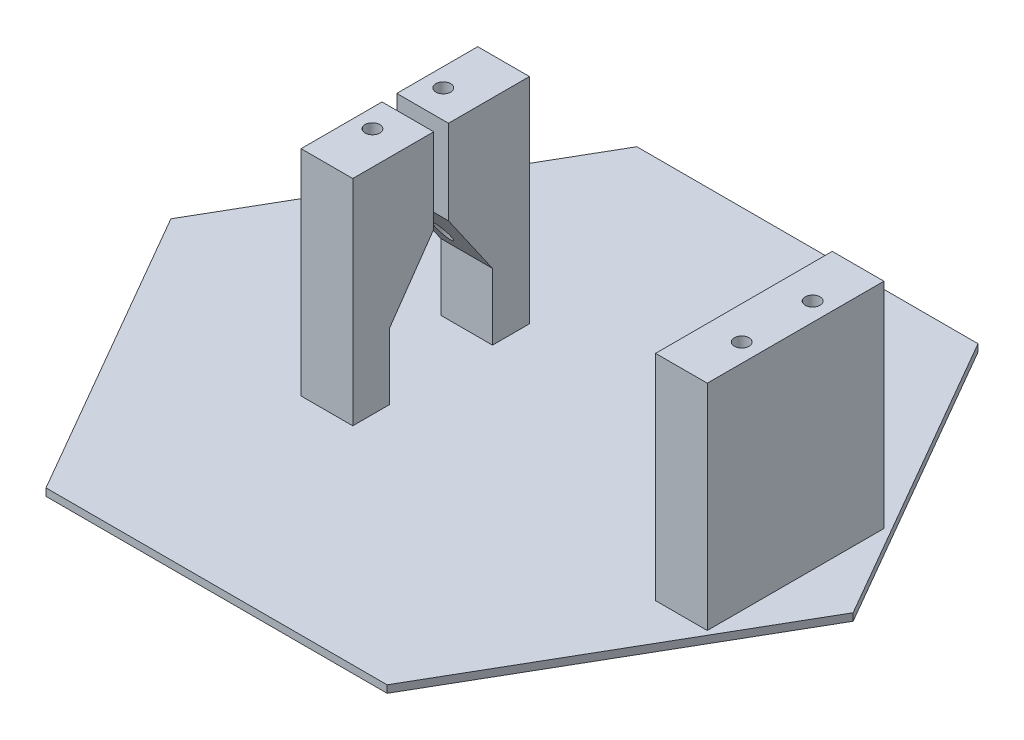
ISO-10303-21;
HEADER;
FILE_DESCRIPTION(('STEP AP214'),'2;1');
FILE_NAME('part.step','',(''),(''),'','','');
FILE_SCHEMA(('AUTOMOTIVE_DESIGN { 1 0 10303 214 1 1 1 1 }'));
ENDSEC;
DATA;
#1=APPLICATION_CONTEXT('core data for automotive mechanical design processes');
#2=APPLICATION_PROTOCOL_DEFINITION('international standard','automotive_design',2000,#1);
#3=PRODUCT_CONTEXT('',#1,'mechanical');
#4=PRODUCT('Part','Part','',(#3));
#5=PRODUCT_RELATED_PRODUCT_CATEGORY('part','',(#4));
#6=PRODUCT_DEFINITION_FORMATION('','',#4);
#7=PRODUCT_DEFINITION_CONTEXT('part definition',#1,'design');
#8=PRODUCT_DEFINITION('design','',#6,#7);
#9=PRODUCT_DEFINITION_SHAPE('','',#8);
#10=(LENGTH_UNIT() NAMED_UNIT(*) SI_UNIT(.MILLI.,.METRE.));
#11=(NAMED_UNIT(*) PLANE_ANGLE_UNIT() SI_UNIT($,.RADIAN.));
#12=(NAMED_UNIT(*) SI_UNIT($,.STERADIAN.) SOLID_ANGLE_UNIT());
#13=UNCERTAINTY_MEASURE_WITH_UNIT(LENGTH_MEASURE(1.E-05),#10,'distance_accuracy_value','');
#14=(GEOMETRIC_REPRESENTATION_CONTEXT(3) GLOBAL_UNCERTAINTY_ASSIGNED_CONTEXT((#13)) GLOBAL_UNIT_ASSIGNED_CONTEXT((#10,
#11,#12)) REPRESENTATION_CONTEXT('',''));
#15=CARTESIAN_POINT('',(0.,0.,0.));
#16=DIRECTION('',(0.,0.,1.));
#17=DIRECTION('',(1.,0.,0.));
#18=AXIS2_PLACEMENT_3D('',#15,#16,#17);
#19=CARTESIAN_POINT('',(-16.6,30.,-6.96020627017977));
#20=DIRECTION('',(1.,0.,0.));
#21=DIRECTION('',(0.,0.,-1.));
#22=AXIS2_PLACEMENT_3D('',#19,#20,#21);
#23=PLANE('',#22);
#24=DIRECTION('',(0.,1.,0.));
#25=VECTOR('',#24,1.);
#26=CARTESIAN_POINT('',(-16.6,-0.001000000000001,-1.));
#27=LINE('',#26,#25);
#28=CARTESIAN_POINT('',(-16.6,18.5632609707497,-1.));
#29=VERTEX_POINT('',#28);
#30=CARTESIAN_POINT('',(-16.6,30.,-1.));
#31=VERTEX_POINT('',#30);
#32=EDGE_CURVE('E62',#29,#31,#27,.T.);
#33=ORIENTED_EDGE('',*,*,#32,.T.);
#34=DIRECTION('',(0.,0.,1.));
#35=VECTOR('',#34,1.);
#36=CARTESIAN_POINT('',(-16.6,30.,-6.96020627017977));
#37=LINE('',#36,#35);
#38=CARTESIAN_POINT('',(-16.6,30.,-11.9602062701798));
#39=VERTEX_POINT('',#38);
#40=EDGE_CURVE('E323',#39,#31,#37,.T.);
#41=ORIENTED_EDGE('',*,*,#40,.F.);
#42=DIRECTION('',(0.,-1.,0.));
#43=VECTOR('',#42,1.);
#44=CARTESIAN_POINT('',(-16.6,30.,-11.9602062701798));
#45=LINE('',#44,#43);
#46=CARTESIAN_POINT('',(-16.6,1.,-11.9602062701798));
#47=VERTEX_POINT('',#46);
#48=EDGE_CURVE('E219',#39,#47,#45,.T.);
#49=ORIENTED_EDGE('',*,*,#48,.T.);
#50=DIRECTION('',(0.,0.,1.));
#51=VECTOR('',#50,1.);
#52=CARTESIAN_POINT('',(-16.6,1.,-6.96020627017977));
#53=LINE('',#52,#51);
#54=CARTESIAN_POINT('',(-16.6,1.,-6.96020627017977));
#55=VERTEX_POINT('',#54);
#56=EDGE_CURVE('E311',#47,#55,#53,.T.);
#57=ORIENTED_EDGE('',*,*,#56,.T.);
#58=DIRECTION('',(0.,-1.,0.));
#59=VECTOR('',#58,1.);
#60=CARTESIAN_POINT('',(-16.6,30.,-6.96020627017977));
#61=LINE('',#60,#59);
#62=CARTESIAN_POINT('',(-16.6,10.,-6.96020627017977));
#63=VERTEX_POINT('',#62);
#64=EDGE_CURVE('E224',#63,#55,#61,.T.);
#65=ORIENTED_EDGE('',*,*,#64,.F.);
#66=DIRECTION('',(0.,0.820763408438593,0.571268262174841));
#67=VECTOR('',#66,1.);
#68=CARTESIAN_POINT('',(-16.6,10.,-6.96020627017977));
#69=LINE('',#68,#67);
#70=EDGE_CURVE('E231',#63,#29,#69,.T.);
#71=ORIENTED_EDGE('',*,*,#70,.T.);
#72=EDGE_LOOP('',(#33,#41,#49,#57,#65,#71));
#73=FACE_BOUND('',#72,.T.);
#74=ADVANCED_FACE('F46',(#73),#23,.F.);
#75=CARTESIAN_POINT('',(-9.6,30.,-11.9602062701798));
#76=DIRECTION('',(-1.,0.,0.));
#77=DIRECTION('',(0.,0.,1.));
#78=AXIS2_PLACEMENT_3D('',#75,#76,#77);
#79=PLANE('',#78);
#80=DIRECTION('',(0.,1.,0.));
#81=VECTOR('',#80,1.);
#82=CARTESIAN_POINT('',(-9.6,-0.001000000000001,-1.));
#83=LINE('',#82,#81);
#84=CARTESIAN_POINT('',(-9.6,18.5632609707497,-1.));
#85=VERTEX_POINT('',#84);
#86=CARTESIAN_POINT('',(-9.6,30.,-1.));
#87=VERTEX_POINT('',#86);
#88=EDGE_CURVE('E196',#85,#87,#83,.T.);
#89=ORIENTED_EDGE('',*,*,#88,.F.);
#90=DIRECTION('',(0.,-0.820763408438594,-0.571268262174841));
#91=VECTOR('',#90,1.);
#92=CARTESIAN_POINT('',(-9.6,10.,-6.96020627017976));
#93=LINE('',#92,#91);
#94=CARTESIAN_POINT('',(-9.6,10.,-6.96020627017977));
#95=VERTEX_POINT('',#94);
#96=EDGE_CURVE('E208',#85,#95,#93,.T.);
#97=ORIENTED_EDGE('',*,*,#96,.T.);
#98=DIRECTION('',(0.,-1.,0.));
#99=VECTOR('',#98,1.);
#100=CARTESIAN_POINT('',(-9.6,30.,-6.96020627017977));
#101=LINE('',#100,#99);
#102=CARTESIAN_POINT('',(-9.6,1.,-6.96020627017977));
#103=VERTEX_POINT('',#102);
#104=EDGE_CURVE('E296',#95,#103,#101,.T.);
#105=ORIENTED_EDGE('',*,*,#104,.T.);
#106=DIRECTION('',(0.,0.,-1.));
#107=VECTOR('',#106,1.);
#108=CARTESIAN_POINT('',(-9.6,1.,-11.9602062701798));
#109=LINE('',#108,#107);
#110=CARTESIAN_POINT('',(-9.6,1.,-11.9602062701798));
#111=VERTEX_POINT('',#110);
#112=EDGE_CURVE('E303',#103,#111,#109,.T.);
#113=ORIENTED_EDGE('',*,*,#112,.T.);
#114=DIRECTION('',(0.,-1.,0.));
#115=VECTOR('',#114,1.);
#116=CARTESIAN_POINT('',(-9.6,30.,-11.9602062701798));
#117=LINE('',#116,#115);
#118=CARTESIAN_POINT('',(-9.6,30.,-11.9602062701798));
#119=VERTEX_POINT('',#118);
#120=EDGE_CURVE('E299',#119,#111,#117,.T.);
#121=ORIENTED_EDGE('',*,*,#120,.F.);
#122=DIRECTION('',(0.,0.,-1.));
#123=VECTOR('',#122,1.);
#124=CARTESIAN_POINT('',(-9.6,30.,-11.9602062701798));
#125=LINE('',#124,#123);
#126=EDGE_CURVE('E211',#87,#119,#125,.T.);
#127=ORIENTED_EDGE('',*,*,#126,.F.);
#128=EDGE_LOOP('',(#89,#97,#105,#113,#121,#127));
#129=FACE_BOUND('',#128,.T.);
#130=ADVANCED_FACE('F207',(#129),#79,.F.);
#131=CARTESIAN_POINT('',(0.,30.,0.));
#132=DIRECTION('',(0.,-1.,0.));
#133=DIRECTION('',(0.,0.,-1.));
#134=AXIS2_PLACEMENT_3D('',#131,#132,#133);
#135=PLANE('',#134);
#136=CARTESIAN_POINT('',(-14.1,30.,-4.8));
#137=DIRECTION('',(0.,-1.,0.));
#138=DIRECTION('',(0.,0.,-1.));
#139=AXIS2_PLACEMENT_3D('',#136,#137,#138);
#140=CIRCLE('',#139,1.);
#141=CARTESIAN_POINT('',(-14.1,30.,-5.8));
#142=VERTEX_POINT('',#141);
#143=EDGE_CURVE('E495',#142,#142,#140,.T.);
#144=ORIENTED_EDGE('',*,*,#143,.T.);
#145=EDGE_LOOP('',(#144));
#146=FACE_BOUND('',#145,.T.);
#147=DIRECTION('',(1.,0.,0.));
#148=VECTOR('',#147,1.);
#149=CARTESIAN_POINT('',(-16.6,30.,-1.));
#150=LINE('',#149,#148);
#151=EDGE_CURVE('E486',#31,#87,#150,.T.);
#152=ORIENTED_EDGE('',*,*,#151,.T.);
#153=ORIENTED_EDGE('',*,*,#126,.T.);
#154=DIRECTION('',(-1.,0.,0.));
#155=VECTOR('',#154,1.);
#156=CARTESIAN_POINT('',(-16.6,30.,-11.9602062701798));
#157=LINE('',#156,#155);
#158=EDGE_CURVE('E307',#119,#39,#157,.T.);
#159=ORIENTED_EDGE('',*,*,#158,.T.);
#160=ORIENTED_EDGE('',*,*,#40,.T.);
#161=EDGE_LOOP('',(#152,#153,#159,#160));
#162=FACE_BOUND('',#161,.T.);
#163=ADVANCED_FACE('F455',(#146,#162),#135,.F.);
#164=CARTESIAN_POINT('',(14.7675580494599,10.,-6.96020627017977));
#165=DIRECTION('',(0.,-0.571268262174841,0.820763408438593));
#166=DIRECTION('',(0.,-0.820763408438594,-0.571268262174841));
#167=AXIS2_PLACEMENT_3D('',#164,#165,#166);
#168=PLANE('',#167);
#169=CARTESIAN_POINT('',(-14.1,13.1036526595985,-4.8));
#170=DIRECTION('',(0.,-0.571268262174841,0.820763408438593));
#171=DIRECTION('',(0.,-0.820763408438594,-0.571268262174841));
#172=AXIS2_PLACEMENT_3D('',#169,#170,#171);
#173=ELLIPSE('',#172,1.75049108485909,1.);
#174=CARTESIAN_POINT('',(-14.1,11.6669136303482,-5.8));
#175=VERTEX_POINT('',#174);
#176=EDGE_CURVE('E229',#175,#175,#173,.F.);
#177=ORIENTED_EDGE('',*,*,#176,.T.);
#178=EDGE_LOOP('',(#177));
#179=FACE_BOUND('',#178,.T.);
#180=ORIENTED_EDGE('',*,*,#96,.F.);
#181=DIRECTION('',(1.,0.,0.));
#182=VECTOR('',#181,1.);
#183=CARTESIAN_POINT('',(-16.6,18.5632609707497,-1.));
#184=LINE('',#183,#182);
#185=EDGE_CURVE('E193',#29,#85,#184,.T.);
#186=ORIENTED_EDGE('',*,*,#185,.F.);
#187=ORIENTED_EDGE('',*,*,#70,.F.);
#188=DIRECTION('',(-1.,0.,0.));
#189=VECTOR('',#188,1.);
#190=CARTESIAN_POINT('',(14.7675580494599,10.,-6.96020627017977));
#191=LINE('',#190,#189);
#192=EDGE_CURVE('E216',#95,#63,#191,.T.);
#193=ORIENTED_EDGE('',*,*,#192,.F.);
#194=EDGE_LOOP('',(#180,#186,#187,#193));
#195=FACE_BOUND('',#194,.T.);
#196=ADVANCED_FACE('F214',(#179,#195),#168,.T.);
#197=CARTESIAN_POINT('',(-16.6,30.,6.96020627017977));
#198=DIRECTION('',(0.,0.,1.));
#199=DIRECTION('',(1.,0.,0.));
#200=AXIS2_PLACEMENT_3D('',#197,#198,#199);
#201=PLANE('',#200);
#202=DIRECTION('',(-1.,0.,0.));
#203=VECTOR('',#202,1.);
#204=CARTESIAN_POINT('',(14.7675580494599,10.,6.96020627017977));
#205=LINE('',#204,#203);
#206=CARTESIAN_POINT('',(-9.59999999999998,10.,6.96020627017977));
#207=VERTEX_POINT('',#206);
#208=CARTESIAN_POINT('',(-16.6,10.,6.96020627017977));
#209=VERTEX_POINT('',#208);
#210=EDGE_CURVE('E238',#207,#209,#205,.T.);
#211=ORIENTED_EDGE('',*,*,#210,.F.);
#212=DIRECTION('',(0.,-1.,0.));
#213=VECTOR('',#212,1.);
#214=CARTESIAN_POINT('',(-9.6,30.,6.96020627017977));
#215=LINE('',#214,#213);
#216=CARTESIAN_POINT('',(-9.6,1.,6.96020627017977));
#217=VERTEX_POINT('',#216);
#218=EDGE_CURVE('E351',#207,#217,#215,.T.);
#219=ORIENTED_EDGE('',*,*,#218,.T.);
#220=DIRECTION('',(-1.,0.,0.));
#221=VECTOR('',#220,1.);
#222=CARTESIAN_POINT('',(-16.6,1.,6.96020627017977));
#223=LINE('',#222,#221);
#224=CARTESIAN_POINT('',(-16.6,1.,6.96020627017977));
#225=VERTEX_POINT('',#224);
#226=EDGE_CURVE('E335',#217,#225,#223,.T.);
#227=ORIENTED_EDGE('',*,*,#226,.T.);
#228=DIRECTION('',(0.,-1.,0.));
#229=VECTOR('',#228,1.);
#230=CARTESIAN_POINT('',(-16.6,30.,6.96020627017977));
#231=LINE('',#230,#229);
#232=EDGE_CURVE('E334',#209,#225,#231,.T.);
#233=ORIENTED_EDGE('',*,*,#232,.F.);
#234=EDGE_LOOP('',(#211,#219,#227,#233));
#235=FACE_BOUND('',#234,.T.);
#236=ADVANCED_FACE('F445',(#235),#201,.F.);
#237=CARTESIAN_POINT('',(0.,1.,0.));
#238=DIRECTION('',(0.,1.,0.));
#239=DIRECTION('',(0.,0.,1.));
#240=AXIS2_PLACEMENT_3D('',#237,#238,#239);
#241=PLANE('',#240);
#242=ORIENTED_EDGE('',*,*,#56,.F.);
#243=DIRECTION('',(-1.,0.,0.));
#244=VECTOR('',#243,1.);
#245=CARTESIAN_POINT('',(-16.6,1.,-11.9602062701798));
#246=LINE('',#245,#244);
#247=EDGE_CURVE('E247',#111,#47,#246,.T.);
#248=ORIENTED_EDGE('',*,*,#247,.F.);
#249=ORIENTED_EDGE('',*,*,#112,.F.);
#250=DIRECTION('',(1.,0.,0.));
#251=VECTOR('',#250,1.);
#252=CARTESIAN_POINT('',(-16.6,1.,-6.96020627017977));
#253=LINE('',#252,#251);
#254=EDGE_CURVE('E306',#55,#103,#253,.T.);
#255=ORIENTED_EDGE('',*,*,#254,.F.);
#256=EDGE_LOOP('',(#242,#248,#249,#255));
#257=FACE_BOUND('',#256,.T.);
#258=DIRECTION('',(1.,0.,0.));
#259=VECTOR('',#258,1.);
#260=CARTESIAN_POINT('',(-9.6,1.,11.9602062701798));
#261=LINE('',#260,#259);
#262=CARTESIAN_POINT('',(-16.6,1.,11.9602062701798));
#263=VERTEX_POINT('',#262);
#264=CARTESIAN_POINT('',(-9.6,1.,11.9602062701798));
#265=VERTEX_POINT('',#264);
#266=EDGE_CURVE('E339',#263,#265,#261,.T.);
#267=ORIENTED_EDGE('',*,*,#266,.F.);
#268=DIRECTION('',(0.,0.,1.));
#269=VECTOR('',#268,1.);
#270=CARTESIAN_POINT('',(-16.6,1.,11.9602062701798));
#271=LINE('',#270,#269);
#272=EDGE_CURVE('E292',#225,#263,#271,.T.);
#273=ORIENTED_EDGE('',*,*,#272,.F.);
#274=ORIENTED_EDGE('',*,*,#226,.F.);
#275=DIRECTION('',(0.,0.,-1.));
#276=VECTOR('',#275,1.);
#277=CARTESIAN_POINT('',(-9.6,1.,6.96020627017977));
#278=LINE('',#277,#276);
#279=EDGE_CURVE('E342',#265,#217,#278,.T.);
#280=ORIENTED_EDGE('',*,*,#279,.F.);
#281=EDGE_LOOP('',(#267,#273,#274,#280));
#282=FACE_BOUND('',#281,.T.);
#283=DIRECTION('',(0.5,0.,-0.866025403784439));
#284=VECTOR('',#283,1.);
#285=CARTESIAN_POINT('',(23.094010767585,1.,40.));
#286=LINE('',#285,#284);
#287=CARTESIAN_POINT('',(23.094010767585,1.,40.));
#288=VERTEX_POINT('',#287);
#289=CARTESIAN_POINT('',(46.1880215351701,1.,0.));
#290=VERTEX_POINT('',#289);
#291=EDGE_CURVE('E362',#288,#290,#286,.T.);
#292=ORIENTED_EDGE('',*,*,#291,.T.);
#293=DIRECTION('',(-0.5,0.,-0.866025403784439));
#294=VECTOR('',#293,1.);
#295=CARTESIAN_POINT('',(46.1880215351701,1.,0.));
#296=LINE('',#295,#294);
#297=CARTESIAN_POINT('',(23.094010767585,1.,-40.));
#298=VERTEX_POINT('',#297);
#299=EDGE_CURVE('E366',#290,#298,#296,.T.);
#300=ORIENTED_EDGE('',*,*,#299,.T.);
#301=DIRECTION('',(-1.,0.,0.));
#302=VECTOR('',#301,1.);
#303=CARTESIAN_POINT('',(23.094010767585,1.,-40.));
#304=LINE('',#303,#302);
#305=CARTESIAN_POINT('',(-23.094010767585,1.,-40.));
#306=VERTEX_POINT('',#305);
#307=EDGE_CURVE('E370',#298,#306,#304,.T.);
#308=ORIENTED_EDGE('',*,*,#307,.T.);
#309=DIRECTION('',(-0.5,0.,0.866025403784439));
#310=VECTOR('',#309,1.);
#311=CARTESIAN_POINT('',(-23.094010767585,1.,-40.));
#312=LINE('',#311,#310);
#313=CARTESIAN_POINT('',(-46.1880215351701,1.,0.));
#314=VERTEX_POINT('',#313);
#315=EDGE_CURVE('E373',#306,#314,#312,.T.);
#316=ORIENTED_EDGE('',*,*,#315,.T.);
#317=DIRECTION('',(0.5,0.,0.866025403784439));
#318=VECTOR('',#317,1.);
#319=CARTESIAN_POINT('',(-46.1880215351701,1.,0.));
#320=LINE('',#319,#318);
#321=CARTESIAN_POINT('',(-23.094010767585,1.,40.));
#322=VERTEX_POINT('',#321);
#323=EDGE_CURVE('E376',#314,#322,#320,.T.);
#324=ORIENTED_EDGE('',*,*,#323,.T.);
#325=DIRECTION('',(1.,0.,0.));
#326=VECTOR('',#325,1.);
#327=CARTESIAN_POINT('',(-23.094010767585,1.,40.));
#328=LINE('',#327,#326);
#329=EDGE_CURVE('E379',#322,#288,#328,.T.);
#330=ORIENTED_EDGE('',*,*,#329,.T.);
#331=EDGE_LOOP('',(#292,#300,#308,#316,#324,#330));
#332=FACE_BOUND('',#331,.T.);
#333=DIRECTION('',(0.,0.,1.));
#334=VECTOR('',#333,1.);
#335=CARTESIAN_POINT('',(31.4,1.,-11.9602062701798));
#336=LINE('',#335,#334);
#337=CARTESIAN_POINT('',(31.4,1.,-11.9602062701798));
#338=VERTEX_POINT('',#337);
#339=CARTESIAN_POINT('',(31.4,1.,11.9602062701798));
#340=VERTEX_POINT('',#339);
#341=EDGE_CURVE('E267',#338,#340,#336,.T.);
#342=ORIENTED_EDGE('',*,*,#341,.F.);
#343=DIRECTION('',(-1.,0.,0.));
#344=VECTOR('',#343,1.);
#345=CARTESIAN_POINT('',(31.4,1.,-11.9602062701798));
#346=LINE('',#345,#344);
#347=CARTESIAN_POINT('',(38.4,1.,-11.9602062701798));
#348=VERTEX_POINT('',#347);
#349=EDGE_CURVE('E270',#348,#338,#346,.T.);
#350=ORIENTED_EDGE('',*,*,#349,.F.);
#351=DIRECTION('',(0.,0.,-1.));
#352=VECTOR('',#351,1.);
#353=CARTESIAN_POINT('',(38.4,1.,11.9602062701798));
#354=LINE('',#353,#352);
#355=CARTESIAN_POINT('',(38.4,1.,11.9602062701798));
#356=VERTEX_POINT('',#355);
#357=EDGE_CURVE('E259',#356,#348,#354,.T.);
#358=ORIENTED_EDGE('',*,*,#357,.F.);
#359=DIRECTION('',(1.,0.,0.));
#360=VECTOR('',#359,1.);
#361=CARTESIAN_POINT('',(31.4,1.,11.9602062701798));
#362=LINE('',#361,#360);
#363=EDGE_CURVE('E262',#340,#356,#362,.T.);
#364=ORIENTED_EDGE('',*,*,#363,.F.);
#365=EDGE_LOOP('',(#342,#350,#358,#364));
#366=FACE_BOUND('',#365,.T.);
#367=ADVANCED_FACE('F432',(#257,#282,#332,#366),#241,.T.);
#368=CARTESIAN_POINT('',(23.094010767585,1.,40.));
#369=DIRECTION('',(-0.866025403784439,0.,-0.5));
#370=DIRECTION('',(-0.5,0.,0.866025403784439));
#371=AXIS2_PLACEMENT_3D('',#368,#369,#370);
#372=PLANE('',#371);
#373=DIRECTION('',(0.5,0.,-0.866025403784439));
#374=VECTOR('',#373,1.);
#375=CARTESIAN_POINT('',(23.094010767585,0.,40.));
#376=LINE('',#375,#374);
#377=CARTESIAN_POINT('',(23.094010767585,0.,40.));
#378=VERTEX_POINT('',#377);
#379=CARTESIAN_POINT('',(46.1880215351701,0.,0.));
#380=VERTEX_POINT('',#379);
#381=EDGE_CURVE('E361',#378,#380,#376,.T.);
#382=ORIENTED_EDGE('',*,*,#381,.T.);
#383=DIRECTION('',(0.,-1.,0.));
#384=VECTOR('',#383,1.);
#385=CARTESIAN_POINT('',(46.1880215351701,1.,0.));
#386=LINE('',#385,#384);
#387=EDGE_CURVE('E419',#290,#380,#386,.T.);
#388=ORIENTED_EDGE('',*,*,#387,.F.);
#389=ORIENTED_EDGE('',*,*,#291,.F.);
#390=DIRECTION('',(0.,-1.,0.));
#391=VECTOR('',#390,1.);
#392=CARTESIAN_POINT('',(23.094010767585,1.,40.));
#393=LINE('',#392,#391);
#394=EDGE_CURVE('E382',#288,#378,#393,.T.);
#395=ORIENTED_EDGE('',*,*,#394,.T.);
#396=EDGE_LOOP('',(#382,#388,#389,#395));
#397=FACE_BOUND('',#396,.T.);
#398=ADVANCED_FACE('F48',(#397),#372,.F.);
#399=CARTESIAN_POINT('',(46.1880215351701,1.,0.));
#400=DIRECTION('',(-0.866025403784439,0.,0.5));
#401=DIRECTION('',(0.5,0.,0.866025403784439));
#402=AXIS2_PLACEMENT_3D('',#399,#400,#401);
#403=PLANE('',#402);
#404=DIRECTION('',(-0.5,0.,-0.866025403784439));
#405=VECTOR('',#404,1.);
#406=CARTESIAN_POINT('',(46.1880215351701,0.,0.));
#407=LINE('',#406,#405);
#408=CARTESIAN_POINT('',(23.094010767585,0.,-40.));
#409=VERTEX_POINT('',#408);
#410=EDGE_CURVE('E386',#380,#409,#407,.T.);
#411=ORIENTED_EDGE('',*,*,#410,.T.);
#412=DIRECTION('',(0.,-1.,0.));
#413=VECTOR('',#412,1.);
#414=CARTESIAN_POINT('',(23.094010767585,1.,-40.));
#415=LINE('',#414,#413);
#416=EDGE_CURVE('E415',#298,#409,#415,.T.);
#417=ORIENTED_EDGE('',*,*,#416,.F.);
#418=ORIENTED_EDGE('',*,*,#299,.F.);
#419=ORIENTED_EDGE('',*,*,#387,.T.);
#420=EDGE_LOOP('',(#411,#417,#418,#419));
#421=FACE_BOUND('',#420,.T.);
#422=ADVANCED_FACE('F813',(#421),#403,.F.);
#423=CARTESIAN_POINT('',(23.094010767585,1.,-40.));
#424=DIRECTION('',(0.,0.,1.));
#425=DIRECTION('',(1.,0.,0.));
#426=AXIS2_PLACEMENT_3D('',#423,#424,#425);
#427=PLANE('',#426);
#428=DIRECTION('',(-1.,0.,0.));
#429=VECTOR('',#428,1.);
#430=CARTESIAN_POINT('',(23.094010767585,0.,-40.));
#431=LINE('',#430,#429);
#432=CARTESIAN_POINT('',(-23.094010767585,0.,-40.));
#433=VERTEX_POINT('',#432);
#434=EDGE_CURVE('E389',#409,#433,#431,.T.);
#435=ORIENTED_EDGE('',*,*,#434,.T.);
#436=DIRECTION('',(0.,-1.,0.));
#437=VECTOR('',#436,1.);
#438=CARTESIAN_POINT('',(-23.094010767585,1.,-40.));
#439=LINE('',#438,#437);
#440=EDGE_CURVE('E411',#306,#433,#439,.T.);
#441=ORIENTED_EDGE('',*,*,#440,.F.);
#442=ORIENTED_EDGE('',*,*,#307,.F.);
#443=ORIENTED_EDGE('',*,*,#416,.T.);
#444=EDGE_LOOP('',(#435,#441,#442,#443));
#445=FACE_BOUND('',#444,.T.);
#446=ADVANCED_FACE('F803',(#445),#427,.F.);
#447=CARTESIAN_POINT('',(-23.094010767585,1.,-40.));
#448=DIRECTION('',(0.866025403784439,0.,0.5));
#449=DIRECTION('',(0.5,0.,-0.866025403784439));
#450=AXIS2_PLACEMENT_3D('',#447,#448,#449);
#451=PLANE('',#450);
#452=DIRECTION('',(-0.5,0.,0.866025403784439));
#453=VECTOR('',#452,1.);
#454=CARTESIAN_POINT('',(-23.094010767585,0.,-40.));
#455=LINE('',#454,#453);
#456=CARTESIAN_POINT('',(-46.1880215351701,0.,0.));
#457=VERTEX_POINT('',#456);
#458=EDGE_CURVE('E392',#433,#457,#455,.T.);
#459=ORIENTED_EDGE('',*,*,#458,.T.);
#460=DIRECTION('',(0.,-1.,0.));
#461=VECTOR('',#460,1.);
#462=CARTESIAN_POINT('',(-46.1880215351701,1.,0.));
#463=LINE('',#462,#461);
#464=EDGE_CURVE('E407',#314,#457,#463,.T.);
#465=ORIENTED_EDGE('',*,*,#464,.F.);
#466=ORIENTED_EDGE('',*,*,#315,.F.);
#467=ORIENTED_EDGE('',*,*,#440,.T.);
#468=EDGE_LOOP('',(#459,#465,#466,#467));
#469=FACE_BOUND('',#468,.T.);
#470=ADVANCED_FACE('F793',(#469),#451,.F.);
#471=CARTESIAN_POINT('',(-46.1880215351701,1.,0.));
#472=DIRECTION('',(0.866025403784439,0.,-0.5));
#473=DIRECTION('',(-0.5,0.,-0.866025403784439));
#474=AXIS2_PLACEMENT_3D('',#471,#472,#473);
#475=PLANE('',#474);
#476=DIRECTION('',(0.5,0.,0.866025403784439));
#477=VECTOR('',#476,1.);
#478=CARTESIAN_POINT('',(-46.1880215351701,0.,0.));
#479=LINE('',#478,#477);
#480=CARTESIAN_POINT('',(-23.094010767585,0.,40.));
#481=VERTEX_POINT('',#480);
#482=EDGE_CURVE('E395',#457,#481,#479,.T.);
#483=ORIENTED_EDGE('',*,*,#482,.T.);
#484=DIRECTION('',(0.,-1.,0.));
#485=VECTOR('',#484,1.);
#486=CARTESIAN_POINT('',(-23.094010767585,1.,40.));
#487=LINE('',#486,#485);
#488=EDGE_CURVE('E403',#322,#481,#487,.T.);
#489=ORIENTED_EDGE('',*,*,#488,.F.);
#490=ORIENTED_EDGE('',*,*,#323,.F.);
#491=ORIENTED_EDGE('',*,*,#464,.T.);
#492=EDGE_LOOP('',(#483,#489,#490,#491));
#493=FACE_BOUND('',#492,.T.);
#494=ADVANCED_FACE('F783',(#493),#475,.F.);
#495=CARTESIAN_POINT('',(-23.094010767585,1.,40.));
#496=DIRECTION('',(0.,0.,-1.));
#497=DIRECTION('',(-1.,0.,0.));
#498=AXIS2_PLACEMENT_3D('',#495,#496,#497);
#499=PLANE('',#498);
#500=DIRECTION('',(1.,0.,0.));
#501=VECTOR('',#500,1.);
#502=CARTESIAN_POINT('',(-23.094010767585,0.,40.));
#503=LINE('',#502,#501);
#504=EDGE_CURVE('E367',#481,#378,#503,.T.);
#505=ORIENTED_EDGE('',*,*,#504,.T.);
#506=ORIENTED_EDGE('',*,*,#394,.F.);
#507=ORIENTED_EDGE('',*,*,#329,.F.);
#508=ORIENTED_EDGE('',*,*,#488,.T.);
#509=EDGE_LOOP('',(#505,#506,#507,#508));
#510=FACE_BOUND('',#509,.T.);
#511=ADVANCED_FACE('F567',(#510),#499,.F.);
#512=CARTESIAN_POINT('',(0.,0.,0.));
#513=DIRECTION('',(0.,1.,0.));
#514=DIRECTION('',(0.,0.,1.));
#515=AXIS2_PLACEMENT_3D('',#512,#513,#514);
#516=PLANE('',#515);
#517=ORIENTED_EDGE('',*,*,#381,.F.);
#518=ORIENTED_EDGE('',*,*,#504,.F.);
#519=ORIENTED_EDGE('',*,*,#482,.F.);
#520=ORIENTED_EDGE('',*,*,#458,.F.);
#521=ORIENTED_EDGE('',*,*,#434,.F.);
#522=ORIENTED_EDGE('',*,*,#410,.F.);
#523=EDGE_LOOP('',(#517,#518,#519,#520,#521,#522));
#524=FACE_BOUND('',#523,.T.);
#525=ADVANCED_FACE('F563',(#524),#516,.F.);
#526=CARTESIAN_POINT('',(-9.6,30.,11.9602062701798));
#527=DIRECTION('',(0.,0.,-1.));
#528=DIRECTION('',(-1.,0.,0.));
#529=AXIS2_PLACEMENT_3D('',#526,#527,#528);
#530=PLANE('',#529);
#531=ORIENTED_EDGE('',*,*,#266,.T.);
#532=DIRECTION('',(0.,-1.,0.));
#533=VECTOR('',#532,1.);
#534=CARTESIAN_POINT('',(-9.6,30.,11.9602062701798));
#535=LINE('',#534,#533);
#536=CARTESIAN_POINT('',(-9.6,30.,11.9602062701798));
#537=VERTEX_POINT('',#536);
#538=EDGE_CURVE('E354',#537,#265,#535,.T.);
#539=ORIENTED_EDGE('',*,*,#538,.F.);
#540=DIRECTION('',(1.,0.,0.));
#541=VECTOR('',#540,1.);
#542=CARTESIAN_POINT('',(-9.6,30.,11.9602062701798));
#543=LINE('',#542,#541);
#544=CARTESIAN_POINT('',(-16.6,30.,11.9602062701798));
#545=VERTEX_POINT('',#544);
#546=EDGE_CURVE('E330',#545,#537,#543,.T.);
#547=ORIENTED_EDGE('',*,*,#546,.F.);
#548=DIRECTION('',(0.,-1.,0.));
#549=VECTOR('',#548,1.);
#550=CARTESIAN_POINT('',(-16.6,30.,11.9602062701798));
#551=LINE('',#550,#549);
#552=EDGE_CURVE('E358',#545,#263,#551,.T.);
#553=ORIENTED_EDGE('',*,*,#552,.T.);
#554=EDGE_LOOP('',(#531,#539,#547,#553));
#555=FACE_BOUND('',#554,.T.);
#556=ADVANCED_FACE('F471',(#555),#530,.F.);
#557=CARTESIAN_POINT('',(-16.6,30.,-11.9602062701798));
#558=DIRECTION('',(0.,0.,1.));
#559=DIRECTION('',(1.,0.,0.));
#560=AXIS2_PLACEMENT_3D('',#557,#558,#559);
#561=PLANE('',#560);
#562=ORIENTED_EDGE('',*,*,#247,.T.);
#563=ORIENTED_EDGE('',*,*,#48,.F.);
#564=ORIENTED_EDGE('',*,*,#158,.F.);
#565=ORIENTED_EDGE('',*,*,#120,.T.);
#566=EDGE_LOOP('',(#562,#563,#564,#565));
#567=FACE_BOUND('',#566,.T.);
#568=ADVANCED_FACE('F462',(#567),#561,.F.);
#569=CARTESIAN_POINT('',(-16.6,30.,1.));
#570=VERTEX_POINT('',#569);
#571=EDGE_CURVE('E322',#570,#545,#37,.T.);
#572=ORIENTED_EDGE('',*,*,#571,.F.);
#573=DIRECTION('',(0.,1.,0.));
#574=VECTOR('',#573,1.);
#575=CARTESIAN_POINT('',(-16.6,-0.001000000000001,1.));
#576=LINE('',#575,#574);
#577=CARTESIAN_POINT('',(-16.6,18.5632609707497,1.));
#578=VERTEX_POINT('',#577);
#579=EDGE_CURVE('E477',#578,#570,#576,.T.);
#580=ORIENTED_EDGE('',*,*,#579,.F.);
#581=DIRECTION('',(0.,0.820763408438593,-0.571268262174841));
#582=VECTOR('',#581,1.);
#583=CARTESIAN_POINT('',(-16.6,10.,6.96020627017977));
#584=LINE('',#583,#582);
#585=EDGE_CURVE('E234',#209,#578,#584,.T.);
#586=ORIENTED_EDGE('',*,*,#585,.F.);
#587=ORIENTED_EDGE('',*,*,#232,.T.);
#588=ORIENTED_EDGE('',*,*,#272,.T.);
#589=ORIENTED_EDGE('',*,*,#552,.F.);
#590=EDGE_LOOP('',(#572,#580,#586,#587,#588,#589));
#591=FACE_BOUND('',#590,.T.);
#592=ADVANCED_FACE('F450',(#591),#23,.F.);
#593=CARTESIAN_POINT('',(-16.6,30.,-6.96020627017977));
#594=DIRECTION('',(0.,0.,-1.));
#595=DIRECTION('',(-1.,0.,0.));
#596=AXIS2_PLACEMENT_3D('',#593,#594,#595);
#597=PLANE('',#596);
#598=ORIENTED_EDGE('',*,*,#104,.F.);
#599=ORIENTED_EDGE('',*,*,#192,.T.);
#600=ORIENTED_EDGE('',*,*,#64,.T.);
#601=ORIENTED_EDGE('',*,*,#254,.T.);
#602=EDGE_LOOP('',(#598,#599,#600,#601));
#603=FACE_BOUND('',#602,.T.);
#604=ADVANCED_FACE('F461',(#603),#597,.F.);
#605=DIRECTION('',(0.,-0.820763408438594,0.571268262174841));
#606=VECTOR('',#605,1.);
#607=CARTESIAN_POINT('',(-9.59999999999998,9.99999999999998,6.96020627017978));
#608=LINE('',#607,#606);
#609=CARTESIAN_POINT('',(-9.59999999999999,18.5632609707497,1.00000000000001));
#610=VERTEX_POINT('',#609);
#611=EDGE_CURVE('E220',#610,#207,#608,.T.);
#612=ORIENTED_EDGE('',*,*,#611,.F.);
#613=DIRECTION('',(0.,1.,0.));
#614=VECTOR('',#613,1.);
#615=CARTESIAN_POINT('',(-9.6,-0.001000000000001,1.));
#616=LINE('',#615,#614);
#617=CARTESIAN_POINT('',(-9.6,30.,1.));
#618=VERTEX_POINT('',#617);
#619=EDGE_CURVE('E70',#610,#618,#616,.T.);
#620=ORIENTED_EDGE('',*,*,#619,.T.);
#621=EDGE_CURVE('E318',#537,#618,#125,.T.);
#622=ORIENTED_EDGE('',*,*,#621,.F.);
#623=ORIENTED_EDGE('',*,*,#538,.T.);
#624=ORIENTED_EDGE('',*,*,#279,.T.);
#625=ORIENTED_EDGE('',*,*,#218,.F.);
#626=EDGE_LOOP('',(#612,#620,#622,#623,#624,#625));
#627=FACE_BOUND('',#626,.T.);
#628=ADVANCED_FACE('F457',(#627),#79,.F.);
#629=CARTESIAN_POINT('',(-14.1,30.,4.8));
#630=DIRECTION('',(0.,-1.,0.));
#631=DIRECTION('',(0.,0.,-1.));
#632=AXIS2_PLACEMENT_3D('',#629,#630,#631);
#633=CIRCLE('',#632,1.);
#634=CARTESIAN_POINT('',(-14.1,30.,3.8));
#635=VERTEX_POINT('',#634);
#636=EDGE_CURVE('E500',#635,#635,#633,.T.);
#637=ORIENTED_EDGE('',*,*,#636,.T.);
#638=EDGE_LOOP('',(#637));
#639=FACE_BOUND('',#638,.T.);
#640=ORIENTED_EDGE('',*,*,#621,.T.);
#641=DIRECTION('',(1.,0.,0.));
#642=VECTOR('',#641,1.);
#643=CARTESIAN_POINT('',(-16.6,30.,1.));
#644=LINE('',#643,#642);
#645=EDGE_CURVE('E202',#570,#618,#644,.T.);
#646=ORIENTED_EDGE('',*,*,#645,.F.);
#647=ORIENTED_EDGE('',*,*,#571,.T.);
#648=ORIENTED_EDGE('',*,*,#546,.T.);
#649=EDGE_LOOP('',(#640,#646,#647,#648));
#650=FACE_BOUND('',#649,.T.);
#651=ADVANCED_FACE('F525',(#639,#650),#135,.F.);
#652=CARTESIAN_POINT('',(0.,30.,0.));
#653=DIRECTION('',(0.,1.,0.));
#654=DIRECTION('',(0.,0.,1.));
#655=AXIS2_PLACEMENT_3D('',#652,#653,#654);
#656=PLANE('',#655);
#657=CARTESIAN_POINT('',(35.9,30.,4.79999999999999));
#658=DIRECTION('',(0.,1.,0.));
#659=DIRECTION('',(0.,0.,1.));
#660=AXIS2_PLACEMENT_3D('',#657,#658,#659);
#661=CIRCLE('',#660,0.999999999999998);
#662=CARTESIAN_POINT('',(35.9,30.,3.8));
#663=VERTEX_POINT('',#662);
#664=EDGE_CURVE('E274',#663,#663,#661,.T.);
#665=ORIENTED_EDGE('',*,*,#664,.F.);
#666=EDGE_LOOP('',(#665));
#667=FACE_BOUND('',#666,.T.);
#668=DIRECTION('',(-1.,0.,0.));
#669=VECTOR('',#668,1.);
#670=CARTESIAN_POINT('',(31.4,30.,-11.9602062701798));
#671=LINE('',#670,#669);
#672=CARTESIAN_POINT('',(38.4,30.,-11.9602062701798));
#673=VERTEX_POINT('',#672);
#674=CARTESIAN_POINT('',(31.4,30.,-11.9602062701798));
#675=VERTEX_POINT('',#674);
#676=EDGE_CURVE('E263',#673,#675,#671,.T.);
#677=ORIENTED_EDGE('',*,*,#676,.T.);
#678=DIRECTION('',(0.,0.,1.));
#679=VECTOR('',#678,1.);
#680=CARTESIAN_POINT('',(31.4,30.,-11.9602062701798));
#681=LINE('',#680,#679);
#682=CARTESIAN_POINT('',(31.4,30.,11.9602062701798));
#683=VERTEX_POINT('',#682);
#684=EDGE_CURVE('E280',#675,#683,#681,.T.);
#685=ORIENTED_EDGE('',*,*,#684,.T.);
#686=DIRECTION('',(1.,0.,0.));
#687=VECTOR('',#686,1.);
#688=CARTESIAN_POINT('',(31.4,30.,11.9602062701798));
#689=LINE('',#688,#687);
#690=CARTESIAN_POINT('',(38.4,30.,11.9602062701798));
#691=VERTEX_POINT('',#690);
#692=EDGE_CURVE('E277',#683,#691,#689,.T.);
#693=ORIENTED_EDGE('',*,*,#692,.T.);
#694=DIRECTION('',(0.,0.,-1.));
#695=VECTOR('',#694,1.);
#696=CARTESIAN_POINT('',(38.4,30.,11.9602062701798));
#697=LINE('',#696,#695);
#698=EDGE_CURVE('E258',#691,#673,#697,.T.);
#699=ORIENTED_EDGE('',*,*,#698,.T.);
#700=EDGE_LOOP('',(#677,#685,#693,#699));
#701=FACE_BOUND('',#700,.T.);
#702=CARTESIAN_POINT('',(35.9,30.,-4.80000000000001));
#703=DIRECTION('',(0.,1.,0.));
#704=DIRECTION('',(0.,0.,-1.));
#705=AXIS2_PLACEMENT_3D('',#702,#703,#704);
#706=CIRCLE('',#705,0.999999999999998);
#707=CARTESIAN_POINT('',(35.9,30.,-5.8));
#708=VERTEX_POINT('',#707);
#709=EDGE_CURVE('E289',#708,#708,#706,.T.);
#710=ORIENTED_EDGE('',*,*,#709,.F.);
#711=EDGE_LOOP('',(#710));
#712=FACE_BOUND('',#711,.T.);
#713=ADVANCED_FACE('F531',(#667,#701,#712),#656,.T.);
#714=CARTESIAN_POINT('',(31.4,30.,-11.9602062701798));
#715=DIRECTION('',(0.,0.,1.));
#716=DIRECTION('',(1.,0.,0.));
#717=AXIS2_PLACEMENT_3D('',#714,#715,#716);
#718=PLANE('',#717);
#719=ORIENTED_EDGE('',*,*,#349,.T.);
#720=DIRECTION('',(0.,-1.,0.));
#721=VECTOR('',#720,1.);
#722=CARTESIAN_POINT('',(31.4,30.,-11.9602062701798));
#723=LINE('',#722,#721);
#724=EDGE_CURVE('E243',#675,#338,#723,.T.);
#725=ORIENTED_EDGE('',*,*,#724,.F.);
#726=ORIENTED_EDGE('',*,*,#676,.F.);
#727=DIRECTION('',(0.,-1.,0.));
#728=VECTOR('',#727,1.);
#729=CARTESIAN_POINT('',(38.4,30.,-11.9602062701798));
#730=LINE('',#729,#728);
#731=EDGE_CURVE('E254',#673,#348,#730,.T.);
#732=ORIENTED_EDGE('',*,*,#731,.T.);
#733=EDGE_LOOP('',(#719,#725,#726,#732));
#734=FACE_BOUND('',#733,.T.);
#735=ADVANCED_FACE('F537',(#734),#718,.F.);
#736=CARTESIAN_POINT('',(31.4,30.,-11.9602062701798));
#737=DIRECTION('',(1.,0.,0.));
#738=DIRECTION('',(0.,0.,-1.));
#739=AXIS2_PLACEMENT_3D('',#736,#737,#738);
#740=PLANE('',#739);
#741=ORIENTED_EDGE('',*,*,#341,.T.);
#742=DIRECTION('',(0.,-1.,0.));
#743=VECTOR('',#742,1.);
#744=CARTESIAN_POINT('',(31.4,30.,11.9602062701798));
#745=LINE('',#744,#743);
#746=EDGE_CURVE('E246',#683,#340,#745,.T.);
#747=ORIENTED_EDGE('',*,*,#746,.F.);
#748=ORIENTED_EDGE('',*,*,#684,.F.);
#749=ORIENTED_EDGE('',*,*,#724,.T.);
#750=EDGE_LOOP('',(#741,#747,#748,#749));
#751=FACE_BOUND('',#750,.T.);
#752=ADVANCED_FACE('F668',(#751),#740,.F.);
#753=CARTESIAN_POINT('',(31.4,30.,11.9602062701798));
#754=DIRECTION('',(0.,0.,-1.));
#755=DIRECTION('',(-1.,0.,0.));
#756=AXIS2_PLACEMENT_3D('',#753,#754,#755);
#757=PLANE('',#756);
#758=ORIENTED_EDGE('',*,*,#363,.T.);
#759=DIRECTION('',(0.,-1.,0.));
#760=VECTOR('',#759,1.);
#761=CARTESIAN_POINT('',(38.4,30.,11.9602062701798));
#762=LINE('',#761,#760);
#763=EDGE_CURVE('E251',#691,#356,#762,.T.);
#764=ORIENTED_EDGE('',*,*,#763,.F.);
#765=ORIENTED_EDGE('',*,*,#692,.F.);
#766=ORIENTED_EDGE('',*,*,#746,.T.);
#767=EDGE_LOOP('',(#758,#764,#765,#766));
#768=FACE_BOUND('',#767,.T.);
#769=ADVANCED_FACE('F672',(#768),#757,.F.);
#770=CARTESIAN_POINT('',(38.4,30.,11.9602062701798));
#771=DIRECTION('',(-1.,0.,0.));
#772=DIRECTION('',(0.,0.,1.));
#773=AXIS2_PLACEMENT_3D('',#770,#771,#772);
#774=PLANE('',#773);
#775=ORIENTED_EDGE('',*,*,#357,.T.);
#776=ORIENTED_EDGE('',*,*,#731,.F.);
#777=ORIENTED_EDGE('',*,*,#698,.F.);
#778=ORIENTED_EDGE('',*,*,#763,.T.);
#779=EDGE_LOOP('',(#775,#776,#777,#778));
#780=FACE_BOUND('',#779,.T.);
#781=ADVANCED_FACE('F676',(#780),#774,.F.);
#782=CARTESIAN_POINT('',(35.9,30.,4.79999999999999));
#783=DIRECTION('',(0.,-1.,0.));
#784=DIRECTION('',(0.,0.,-1.));
#785=AXIS2_PLACEMENT_3D('',#782,#783,#784);
#786=CYLINDRICAL_SURFACE('',#785,0.999999999999998);
#787=CARTESIAN_POINT('',(35.9,1.,4.79999999999999));
#788=DIRECTION('',(0.,1.,0.));
#789=DIRECTION('',(0.,0.,1.));
#790=AXIS2_PLACEMENT_3D('',#787,#788,#789);
#791=CIRCLE('',#790,0.999999999999998);
#792=CARTESIAN_POINT('',(35.9,1.,3.8));
#793=VERTEX_POINT('',#792);
#794=EDGE_CURVE('E11',#793,#793,#791,.F.);
#795=CARTESIAN_POINT('',(35.9,30.,3.8));
#796=CARTESIAN_POINT('',(35.9,29.6979166666667,3.8));
#797=CARTESIAN_POINT('',(35.9,29.3958333333333,3.8));
#798=CARTESIAN_POINT('',(35.9,28.7916666666667,3.8));
#799=CARTESIAN_POINT('',(35.9,28.4895833333333,3.8));
#800=CARTESIAN_POINT('',(35.9,27.8854166666667,3.8));
#801=CARTESIAN_POINT('',(35.9,27.5833333333333,3.8));
#802=CARTESIAN_POINT('',(35.9,26.9791666666667,3.8));
#803=CARTESIAN_POINT('',(35.9,26.6770833333333,3.8));
#804=CARTESIAN_POINT('',(35.9,26.0729166666667,3.8));
#805=CARTESIAN_POINT('',(35.9,25.7708333333333,3.8));
#806=CARTESIAN_POINT('',(35.9,25.1666666666667,3.8));
#807=CARTESIAN_POINT('',(35.9,24.8645833333333,3.8));
#808=CARTESIAN_POINT('',(35.9,24.2604166666667,3.8));
#809=CARTESIAN_POINT('',(35.9,23.9583333333333,3.8));
#810=CARTESIAN_POINT('',(35.9,23.3541666666667,3.8));
#811=CARTESIAN_POINT('',(35.9,23.0520833333333,3.8));
#812=CARTESIAN_POINT('',(35.9,22.4479166666667,3.8));
#813=CARTESIAN_POINT('',(35.9,22.1458333333333,3.8));
#814=CARTESIAN_POINT('',(35.9,21.5416666666667,3.8));
#815=CARTESIAN_POINT('',(35.9,21.2395833333333,3.8));
#816=CARTESIAN_POINT('',(35.9,20.6354166666667,3.8));
#817=CARTESIAN_POINT('',(35.9,20.3333333333333,3.8));
#818=CARTESIAN_POINT('',(35.9,19.7291666666667,3.8));
#819=CARTESIAN_POINT('',(35.9,19.4270833333333,3.8));
#820=CARTESIAN_POINT('',(35.9,18.8229166666667,3.8));
#821=CARTESIAN_POINT('',(35.9,18.5208333333333,3.8));
#822=CARTESIAN_POINT('',(35.9,17.9166666666667,3.8));
#823=CARTESIAN_POINT('',(35.9,17.6145833333333,3.8));
#824=CARTESIAN_POINT('',(35.9,17.0104166666667,3.8));
#825=CARTESIAN_POINT('',(35.9,16.7083333333333,3.8));
#826=CARTESIAN_POINT('',(35.9,16.1041666666667,3.8));
#827=CARTESIAN_POINT('',(35.9,15.8020833333333,3.8));
#828=CARTESIAN_POINT('',(35.9,15.1979166666667,3.8));
#829=CARTESIAN_POINT('',(35.9,14.8958333333333,3.8));
#830=CARTESIAN_POINT('',(35.9,14.2916666666667,3.8));
#831=CARTESIAN_POINT('',(35.9,13.9895833333333,3.8));
#832=CARTESIAN_POINT('',(35.9,13.3854166666667,3.8));
#833=CARTESIAN_POINT('',(35.9,13.0833333333333,3.8));
#834=CARTESIAN_POINT('',(35.9,12.4791666666667,3.8));
#835=CARTESIAN_POINT('',(35.9,12.1770833333333,3.8));
#836=CARTESIAN_POINT('',(35.9,11.5729166666667,3.8));
#837=CARTESIAN_POINT('',(35.9,11.2708333333333,3.8));
#838=CARTESIAN_POINT('',(35.9,10.6666666666667,3.8));
#839=CARTESIAN_POINT('',(35.9,10.3645833333333,3.8));
#840=CARTESIAN_POINT('',(35.9,9.76041666666667,3.8));
#841=CARTESIAN_POINT('',(35.9,9.45833333333333,3.8));
#842=CARTESIAN_POINT('',(35.9,8.85416666666667,3.8));
#843=CARTESIAN_POINT('',(35.9,8.55208333333333,3.8));
#844=CARTESIAN_POINT('',(35.9,7.94791666666667,3.8));
#845=CARTESIAN_POINT('',(35.9,7.64583333333333,3.8));
#846=CARTESIAN_POINT('',(35.9,7.04166666666667,3.8));
#847=CARTESIAN_POINT('',(35.9,6.73958333333333,3.8));
#848=CARTESIAN_POINT('',(35.9,6.13541666666667,3.8));
#849=CARTESIAN_POINT('',(35.9,5.83333333333334,3.8));
#850=CARTESIAN_POINT('',(35.9,5.22916666666667,3.8));
#851=CARTESIAN_POINT('',(35.9,4.92708333333333,3.8));
#852=CARTESIAN_POINT('',(35.9,4.32291666666667,3.8));
#853=CARTESIAN_POINT('',(35.9,4.02083333333333,3.8));
#854=CARTESIAN_POINT('',(35.9,3.41666666666667,3.8));
#855=CARTESIAN_POINT('',(35.9,3.11458333333333,3.8));
#856=CARTESIAN_POINT('',(35.9,2.51041666666667,3.8));
#857=CARTESIAN_POINT('',(35.9,2.20833333333334,3.8));
#858=CARTESIAN_POINT('',(35.9,1.60416666666667,3.8));
#859=CARTESIAN_POINT('',(35.9,1.30208333333333,3.8));
#860=CARTESIAN_POINT('',(35.9,1.,3.8));
#861=B_SPLINE_CURVE_WITH_KNOTS('',3,(#795,#796,#797,#798,#799,#800,#801,#802,#803,#804,#805,
#806,#807,#808,#809,#810,#811,#812,#813,#814,#815,#816,#817,#818,#819,#820,#821,#822,#823,#824,
#825,#826,#827,#828,#829,#830,#831,#832,#833,#834,#835,#836,#837,#838,#839,#840,#841,#842,#843,
#844,#845,#846,#847,#848,#849,#850,#851,#852,#853,#854,#855,#856,#857,#858,#859,#860),
.UNSPECIFIED.,.F.,.F.,(4,2,2,2,2,2,2,2,2,2,2,2,2,2,2,2,2,2,2,2,2,2,2,2,2,2,2,2,2,2,2,2,4),(0.,
0.906249999999997,1.8125,2.71875,3.625,4.53125,5.4375,6.34375,7.25,8.15625,9.0625,9.96875,
10.875,11.78125,12.6875,13.59375,14.5,15.40625,16.3125,17.21875,18.125,19.03125,19.9375,
20.84375,21.75,22.65625,23.5625,24.46875,25.375,26.28125,27.1875,28.09375,29.),.UNSPECIFIED.);
#862=EDGE_CURVE('BSEAM439',#663,#793,#861,.T.);
#863=ORIENTED_EDGE('',*,*,#664,.T.);
#864=ORIENTED_EDGE('',*,*,#794,.T.);
#865=ORIENTED_EDGE('',*,*,#862,.T.);
#866=ORIENTED_EDGE('',*,*,#862,.F.);
#867=EDGE_LOOP('',(#863,#865,#864,#866));
#868=FACE_BOUND('',#867,.T.);
#869=ADVANCED_FACE('F439',(#868),#786,.F.);
#870=CARTESIAN_POINT('',(35.9,30.,-4.80000000000001));
#871=DIRECTION('',(0.,-1.,0.));
#872=DIRECTION('',(0.,0.,-1.));
#873=AXIS2_PLACEMENT_3D('',#870,#871,#872);
#874=CYLINDRICAL_SURFACE('',#873,0.999999999999998);
#875=CARTESIAN_POINT('',(35.9,1.,-4.80000000000001));
#876=DIRECTION('',(0.,1.,0.));
#877=DIRECTION('',(0.,0.,1.));
#878=AXIS2_PLACEMENT_3D('',#875,#876,#877);
#879=CIRCLE('',#878,0.999999999999998);
#880=CARTESIAN_POINT('',(35.9,1.,-5.8));
#881=VERTEX_POINT('',#880);
#882=EDGE_CURVE('E55',#881,#881,#879,.F.);
#883=CARTESIAN_POINT('',(35.9,30.,-5.8));
#884=CARTESIAN_POINT('',(35.9,29.6979166666667,-5.8));
#885=CARTESIAN_POINT('',(35.9,29.3958333333333,-5.8));
#886=CARTESIAN_POINT('',(35.9,28.7916666666667,-5.8));
#887=CARTESIAN_POINT('',(35.9,28.4895833333333,-5.8));
#888=CARTESIAN_POINT('',(35.9,27.8854166666667,-5.8));
#889=CARTESIAN_POINT('',(35.9,27.5833333333333,-5.8));
#890=CARTESIAN_POINT('',(35.9,26.9791666666667,-5.8));
#891=CARTESIAN_POINT('',(35.9,26.6770833333333,-5.8));
#892=CARTESIAN_POINT('',(35.9,26.0729166666667,-5.8));
#893=CARTESIAN_POINT('',(35.9,25.7708333333333,-5.8));
#894=CARTESIAN_POINT('',(35.9,25.1666666666667,-5.8));
#895=CARTESIAN_POINT('',(35.9,24.8645833333333,-5.8));
#896=CARTESIAN_POINT('',(35.9,24.2604166666667,-5.8));
#897=CARTESIAN_POINT('',(35.9,23.9583333333333,-5.8));
#898=CARTESIAN_POINT('',(35.9,23.3541666666667,-5.8));
#899=CARTESIAN_POINT('',(35.9,23.0520833333333,-5.8));
#900=CARTESIAN_POINT('',(35.9,22.4479166666667,-5.8));
#901=CARTESIAN_POINT('',(35.9,22.1458333333333,-5.8));
#902=CARTESIAN_POINT('',(35.9,21.5416666666667,-5.8));
#903=CARTESIAN_POINT('',(35.9,21.2395833333333,-5.8));
#904=CARTESIAN_POINT('',(35.9,20.6354166666667,-5.8));
#905=CARTESIAN_POINT('',(35.9,20.3333333333333,-5.8));
#906=CARTESIAN_POINT('',(35.9,19.7291666666667,-5.8));
#907=CARTESIAN_POINT('',(35.9,19.4270833333333,-5.8));
#908=CARTESIAN_POINT('',(35.9,18.8229166666667,-5.8));
#909=CARTESIAN_POINT('',(35.9,18.5208333333333,-5.8));
#910=CARTESIAN_POINT('',(35.9,17.9166666666667,-5.8));
#911=CARTESIAN_POINT('',(35.9,17.6145833333333,-5.8));
#912=CARTESIAN_POINT('',(35.9,17.0104166666667,-5.8));
#913=CARTESIAN_POINT('',(35.9,16.7083333333333,-5.8));
#914=CARTESIAN_POINT('',(35.9,16.1041666666667,-5.8));
#915=CARTESIAN_POINT('',(35.9,15.8020833333333,-5.8));
#916=CARTESIAN_POINT('',(35.9,15.1979166666667,-5.8));
#917=CARTESIAN_POINT('',(35.9,14.8958333333333,-5.8));
#918=CARTESIAN_POINT('',(35.9,14.2916666666667,-5.8));
#919=CARTESIAN_POINT('',(35.9,13.9895833333333,-5.8));
#920=CARTESIAN_POINT('',(35.9,13.3854166666667,-5.8));
#921=CARTESIAN_POINT('',(35.9,13.0833333333333,-5.8));
#922=CARTESIAN_POINT('',(35.9,12.4791666666667,-5.8));
#923=CARTESIAN_POINT('',(35.9,12.1770833333333,-5.8));
#924=CARTESIAN_POINT('',(35.9,11.5729166666667,-5.8));
#925=CARTESIAN_POINT('',(35.9,11.2708333333333,-5.8));
#926=CARTESIAN_POINT('',(35.9,10.6666666666667,-5.8));
#927=CARTESIAN_POINT('',(35.9,10.3645833333333,-5.8));
#928=CARTESIAN_POINT('',(35.9,9.76041666666667,-5.8));
#929=CARTESIAN_POINT('',(35.9,9.45833333333333,-5.8));
#930=CARTESIAN_POINT('',(35.9,8.85416666666667,-5.8));
#931=CARTESIAN_POINT('',(35.9,8.55208333333333,-5.8));
#932=CARTESIAN_POINT('',(35.9,7.94791666666667,-5.8));
#933=CARTESIAN_POINT('',(35.9,7.64583333333333,-5.8));
#934=CARTESIAN_POINT('',(35.9,7.04166666666667,-5.8));
#935=CARTESIAN_POINT('',(35.9,6.73958333333333,-5.8));
#936=CARTESIAN_POINT('',(35.9,6.13541666666667,-5.8));
#937=CARTESIAN_POINT('',(35.9,5.83333333333334,-5.8));
#938=CARTESIAN_POINT('',(35.9,5.22916666666667,-5.8));
#939=CARTESIAN_POINT('',(35.9,4.92708333333333,-5.8));
#940=CARTESIAN_POINT('',(35.9,4.32291666666667,-5.8));
#941=CARTESIAN_POINT('',(35.9,4.02083333333333,-5.8));
#942=CARTESIAN_POINT('',(35.9,3.41666666666667,-5.8));
#943=CARTESIAN_POINT('',(35.9,3.11458333333333,-5.8));
#944=CARTESIAN_POINT('',(35.9,2.51041666666667,-5.8));
#945=CARTESIAN_POINT('',(35.9,2.20833333333334,-5.8));
#946=CARTESIAN_POINT('',(35.9,1.60416666666667,-5.8));
#947=CARTESIAN_POINT('',(35.9,1.30208333333333,-5.8));
#948=CARTESIAN_POINT('',(35.9,1.,-5.8));
#949=B_SPLINE_CURVE_WITH_KNOTS('',3,(#883,#884,#885,#886,#887,#888,#889,#890,#891,#892,#893,
#894,#895,#896,#897,#898,#899,#900,#901,#902,#903,#904,#905,#906,#907,#908,#909,#910,#911,#912,
#913,#914,#915,#916,#917,#918,#919,#920,#921,#922,#923,#924,#925,#926,#927,#928,#929,#930,#931,
#932,#933,#934,#935,#936,#937,#938,#939,#940,#941,#942,#943,#944,#945,#946,#947,#948),
.UNSPECIFIED.,.F.,.F.,(4,2,2,2,2,2,2,2,2,2,2,2,2,2,2,2,2,2,2,2,2,2,2,2,2,2,2,2,2,2,2,2,4),(0.,
0.906249999999997,1.8125,2.71875,3.625,4.53125,5.4375,6.34375,7.25,8.15625,9.0625,9.96875,
10.875,11.78125,12.6875,13.59375,14.5,15.40625,16.3125,17.21875,18.125,19.03125,19.9375,
20.84375,21.75,22.65625,23.5625,24.46875,25.375,26.28125,27.1875,28.09375,29.),.UNSPECIFIED.);
#950=EDGE_CURVE('BSEAM426',#708,#881,#949,.T.);
#951=ORIENTED_EDGE('',*,*,#709,.T.);
#952=ORIENTED_EDGE('',*,*,#882,.T.);
#953=ORIENTED_EDGE('',*,*,#950,.T.);
#954=ORIENTED_EDGE('',*,*,#950,.F.);
#955=EDGE_LOOP('',(#951,#953,#952,#954));
#956=FACE_BOUND('',#955,.T.);
#957=ADVANCED_FACE('F426',(#956),#874,.F.);
#958=ORIENTED_EDGE('',*,*,#882,.F.);
#959=EDGE_LOOP('',(#958));
#960=FACE_BOUND('',#959,.T.);
#961=ADVANCED_FACE('F428',(#960),#241,.T.);
#962=ORIENTED_EDGE('',*,*,#794,.F.);
#963=EDGE_LOOP('',(#962));
#964=FACE_BOUND('',#963,.T.);
#965=ADVANCED_FACE('F430',(#964),#241,.T.);
#966=CARTESIAN_POINT('',(14.7675580494599,10.,6.96020627017977));
#967=DIRECTION('',(0.,0.571268262174841,0.820763408438593));
#968=DIRECTION('',(0.,-0.820763408438594,0.571268262174841));
#969=AXIS2_PLACEMENT_3D('',#966,#967,#968);
#970=PLANE('',#969);
#971=CARTESIAN_POINT('',(-14.1,13.1036526595985,4.8));
#972=DIRECTION('',(0.,0.571268262174841,0.820763408438593));
#973=DIRECTION('',(0.,-0.820763408438594,0.571268262174841));
#974=AXIS2_PLACEMENT_3D('',#971,#972,#973);
#975=ELLIPSE('',#974,1.75049108485909,1.);
#976=CARTESIAN_POINT('',(-14.1,11.6669136303482,5.8));
#977=VERTEX_POINT('',#976);
#978=EDGE_CURVE('E504',#977,#977,#975,.F.);
#979=ORIENTED_EDGE('',*,*,#978,.F.);
#980=EDGE_LOOP('',(#979));
#981=FACE_BOUND('',#980,.T.);
#982=ORIENTED_EDGE('',*,*,#585,.T.);
#983=DIRECTION('',(-1.,0.,0.));
#984=VECTOR('',#983,1.);
#985=CARTESIAN_POINT('',(-16.6,18.5632609707497,1.));
#986=LINE('',#985,#984);
#987=EDGE_CURVE('E203',#610,#578,#986,.T.);
#988=ORIENTED_EDGE('',*,*,#987,.F.);
#989=ORIENTED_EDGE('',*,*,#611,.T.);
#990=ORIENTED_EDGE('',*,*,#210,.T.);
#991=EDGE_LOOP('',(#982,#988,#989,#990));
#992=FACE_BOUND('',#991,.T.);
#993=ADVANCED_FACE('F437',(#981,#992),#970,.F.);
#994=CARTESIAN_POINT('',(-14.1,32.8284271247462,4.8));
#995=DIRECTION('',(0.,-1.,0.));
#996=DIRECTION('',(0.,0.,-1.));
#997=AXIS2_PLACEMENT_3D('',#994,#995,#996);
#998=CYLINDRICAL_SURFACE('',#997,1.);
#999=ORIENTED_EDGE('',*,*,#636,.F.);
#1000=EDGE_LOOP('',(#999));
#1001=FACE_BOUND('',#1000,.T.);
#1002=ORIENTED_EDGE('',*,*,#978,.T.);
#1003=EDGE_LOOP('',(#1002));
#1004=FACE_BOUND('',#1003,.T.);
#1005=ADVANCED_FACE('F519',(#1001,#1004),#998,.F.);
#1006=CARTESIAN_POINT('',(-14.1,32.8284271247462,-4.8));
#1007=DIRECTION('',(0.,-1.,0.));
#1008=DIRECTION('',(0.,0.,-1.));
#1009=AXIS2_PLACEMENT_3D('',#1006,#1007,#1008);
#1010=CYLINDRICAL_SURFACE('',#1009,1.);
#1011=ORIENTED_EDGE('',*,*,#176,.F.);
#1012=EDGE_LOOP('',(#1011));
#1013=FACE_BOUND('',#1012,.T.);
#1014=ORIENTED_EDGE('',*,*,#143,.F.);
#1015=EDGE_LOOP('',(#1014));
#1016=FACE_BOUND('',#1015,.T.);
#1017=ADVANCED_FACE('F516',(#1013,#1016),#1010,.F.);
#1018=CARTESIAN_POINT('',(-16.6,-0.001000000000001,1.));
#1019=DIRECTION('',(0.,0.,1.));
#1020=DIRECTION('',(1.,0.,0.));
#1021=AXIS2_PLACEMENT_3D('',#1018,#1019,#1020);
#1022=PLANE('',#1021);
#1023=ORIENTED_EDGE('',*,*,#987,.T.);
#1024=ORIENTED_EDGE('',*,*,#579,.T.);
#1025=ORIENTED_EDGE('',*,*,#645,.T.);
#1026=ORIENTED_EDGE('',*,*,#619,.F.);
#1027=EDGE_LOOP('',(#1023,#1024,#1025,#1026));
#1028=FACE_BOUND('',#1027,.T.);
#1029=ADVANCED_FACE('F518',(#1028),#1022,.F.);
#1030=CARTESIAN_POINT('',(-16.6,-0.001000000000001,-1.));
#1031=DIRECTION('',(0.,0.,1.));
#1032=DIRECTION('',(1.,0.,0.));
#1033=AXIS2_PLACEMENT_3D('',#1030,#1031,#1032);
#1034=PLANE('',#1033);
#1035=ORIENTED_EDGE('',*,*,#185,.T.);
#1036=ORIENTED_EDGE('',*,*,#88,.T.);
#1037=ORIENTED_EDGE('',*,*,#151,.F.);
#1038=ORIENTED_EDGE('',*,*,#32,.F.);
#1039=EDGE_LOOP('',(#1035,#1036,#1037,#1038));
#1040=FACE_BOUND('',#1039,.T.);
#1041=ADVANCED_FACE('F195',(#1040),#1034,.T.);
#1042=CLOSED_SHELL('',(#74,#130,#163,#196,#236,#367,#398,#422,#446,#470,#494,#511,#525,#556,
#568,#592,#604,#628,#651,#713,#735,#752,#769,#781,#869,#957,#961,#965,#993,#1005,#1017,#1029,#1041));
#1043=MANIFOLD_SOLID_BREP('B2',#1042);
#1044=ADVANCED_BREP_SHAPE_REPRESENTATION('',(#18,#1043),#14);
#1045=SHAPE_DEFINITION_REPRESENTATION(#9,#1044);
ENDSEC;
END-ISO-10303-21;
